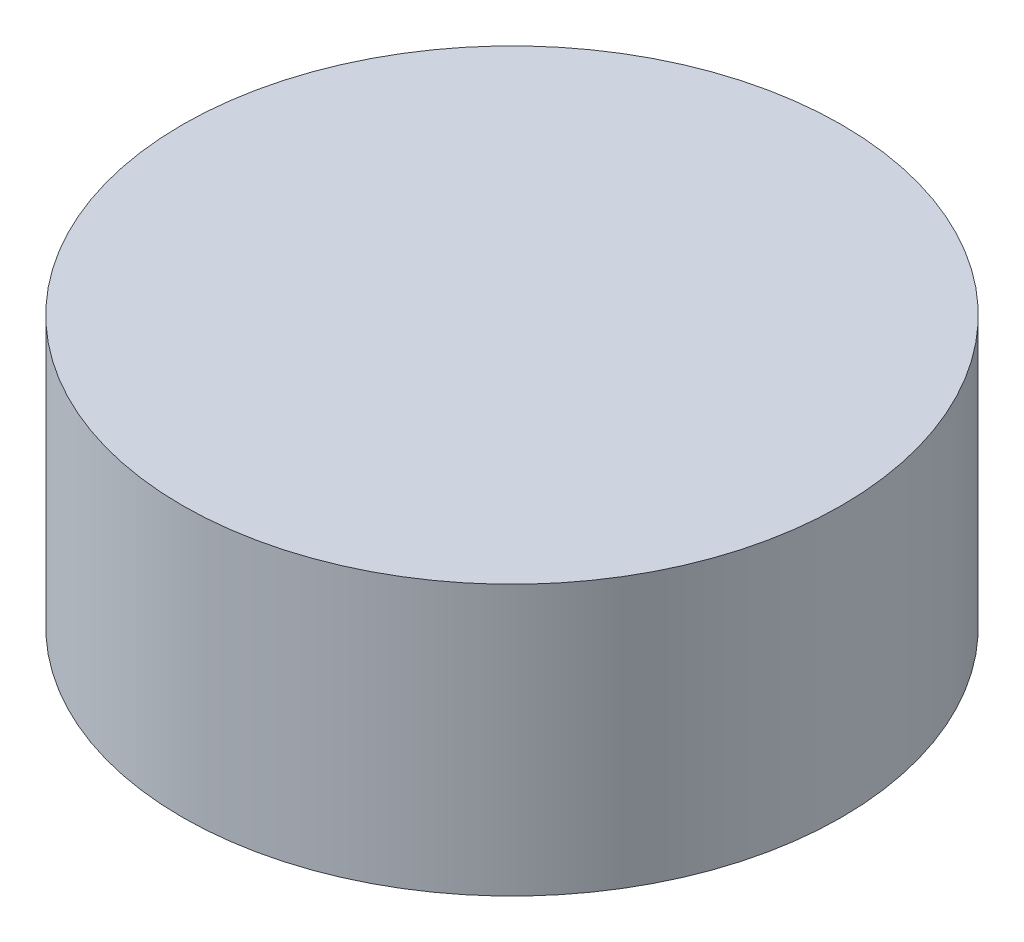
ISO-10303-21;
HEADER;
FILE_DESCRIPTION(('STEP AP214'),'2;1');
FILE_NAME('part.step','',(''),(''),'','','');
FILE_SCHEMA(('AUTOMOTIVE_DESIGN { 1 0 10303 214 1 1 1 1 }'));
ENDSEC;
DATA;
#1=APPLICATION_CONTEXT('core data for automotive mechanical design processes');
#2=APPLICATION_PROTOCOL_DEFINITION('international standard','automotive_design',2000,#1);
#3=PRODUCT_CONTEXT('',#1,'mechanical');
#4=PRODUCT('Part','Part','',(#3));
#5=PRODUCT_RELATED_PRODUCT_CATEGORY('part','',(#4));
#6=PRODUCT_DEFINITION_FORMATION('','',#4);
#7=PRODUCT_DEFINITION_CONTEXT('part definition',#1,'design');
#8=PRODUCT_DEFINITION('design','',#6,#7);
#9=PRODUCT_DEFINITION_SHAPE('','',#8);
#10=(LENGTH_UNIT() NAMED_UNIT(*) SI_UNIT(.MILLI.,.METRE.));
#11=(NAMED_UNIT(*) PLANE_ANGLE_UNIT() SI_UNIT($,.RADIAN.));
#12=(NAMED_UNIT(*) SI_UNIT($,.STERADIAN.) SOLID_ANGLE_UNIT());
#13=UNCERTAINTY_MEASURE_WITH_UNIT(LENGTH_MEASURE(1.E-05),#10,'distance_accuracy_value','');
#14=(GEOMETRIC_REPRESENTATION_CONTEXT(3) GLOBAL_UNCERTAINTY_ASSIGNED_CONTEXT((#13)) GLOBAL_UNIT_ASSIGNED_CONTEXT((#10,
#11,#12)) REPRESENTATION_CONTEXT('',''));
#15=CARTESIAN_POINT('',(0.,0.,0.));
#16=DIRECTION('',(0.,0.,1.));
#17=DIRECTION('',(1.,0.,0.));
#18=AXIS2_PLACEMENT_3D('',#15,#16,#17);
#19=CARTESIAN_POINT('',(3.17433715756182,-2.03067894885684,0.));
#20=DIRECTION('',(0.,1.,0.));
#21=DIRECTION('',(-1.,0.,0.));
#22=AXIS2_PLACEMENT_3D('',#19,#20,#21);
#23=PLANE('',#22);
#24=CARTESIAN_POINT('',(3.17433715756182,-2.03067894885684,0.));
#25=DIRECTION('',(0.,1.,0.));
#26=DIRECTION('',(-1.,0.,0.));
#27=AXIS2_PLACEMENT_3D('',#24,#25,#26);
#28=CIRCLE('',#27,4.88343558282209);
#29=CARTESIAN_POINT('',(-1.70909842526027,-2.03067894885684,0.));
#30=VERTEX_POINT('',#29);
#31=EDGE_CURVE('E10',#30,#30,#28,.T.);
#32=ORIENTED_EDGE('',*,*,#31,.F.);
#33=EDGE_LOOP('',(#32));
#34=FACE_BOUND('',#33,.T.);
#35=ADVANCED_FACE('F41',(#34),#23,.F.);
#36=CARTESIAN_POINT('',(3.17433715756182,1.96932105114316,0.));
#37=DIRECTION('',(0.,1.,0.));
#38=DIRECTION('',(-1.,0.,0.));
#39=AXIS2_PLACEMENT_3D('',#36,#37,#38);
#40=CYLINDRICAL_SURFACE('',#39,4.88343558282209);
#41=CARTESIAN_POINT('',(3.17433715756182,1.96932105114316,0.));
#42=DIRECTION('',(0.,1.,0.));
#43=DIRECTION('',(-1.,0.,0.));
#44=AXIS2_PLACEMENT_3D('',#41,#42,#43);
#45=CIRCLE('',#44,4.88343558282209);
#46=CARTESIAN_POINT('',(-1.70909842526027,1.96932105114316,0.));
#47=VERTEX_POINT('',#46);
#48=EDGE_CURVE('E48',#47,#47,#45,.T.);
#49=ORIENTED_EDGE('',*,*,#48,.F.);
#50=EDGE_LOOP('',(#49));
#51=FACE_BOUND('',#50,.T.);
#52=ORIENTED_EDGE('',*,*,#31,.T.);
#53=EDGE_LOOP('',(#52));
#54=FACE_BOUND('',#53,.T.);
#55=ADVANCED_FACE('F57',(#51,#54),#40,.T.);
#56=CARTESIAN_POINT('',(3.17433715756182,1.96932105114316,0.));
#57=DIRECTION('',(0.,-1.,0.));
#58=DIRECTION('',(1.,0.,0.));
#59=AXIS2_PLACEMENT_3D('',#56,#57,#58);
#60=PLANE('',#59);
#61=ORIENTED_EDGE('',*,*,#48,.T.);
#62=EDGE_LOOP('',(#61));
#63=FACE_BOUND('',#62,.T.);
#64=ADVANCED_FACE('F55',(#63),#60,.F.);
#65=CLOSED_SHELL('',(#35,#55,#64));
#66=MANIFOLD_SOLID_BREP('B2',#65);
#67=ADVANCED_BREP_SHAPE_REPRESENTATION('',(#18,#66),#14);
#68=SHAPE_DEFINITION_REPRESENTATION(#9,#67);
ENDSEC;
END-ISO-10303-21;
